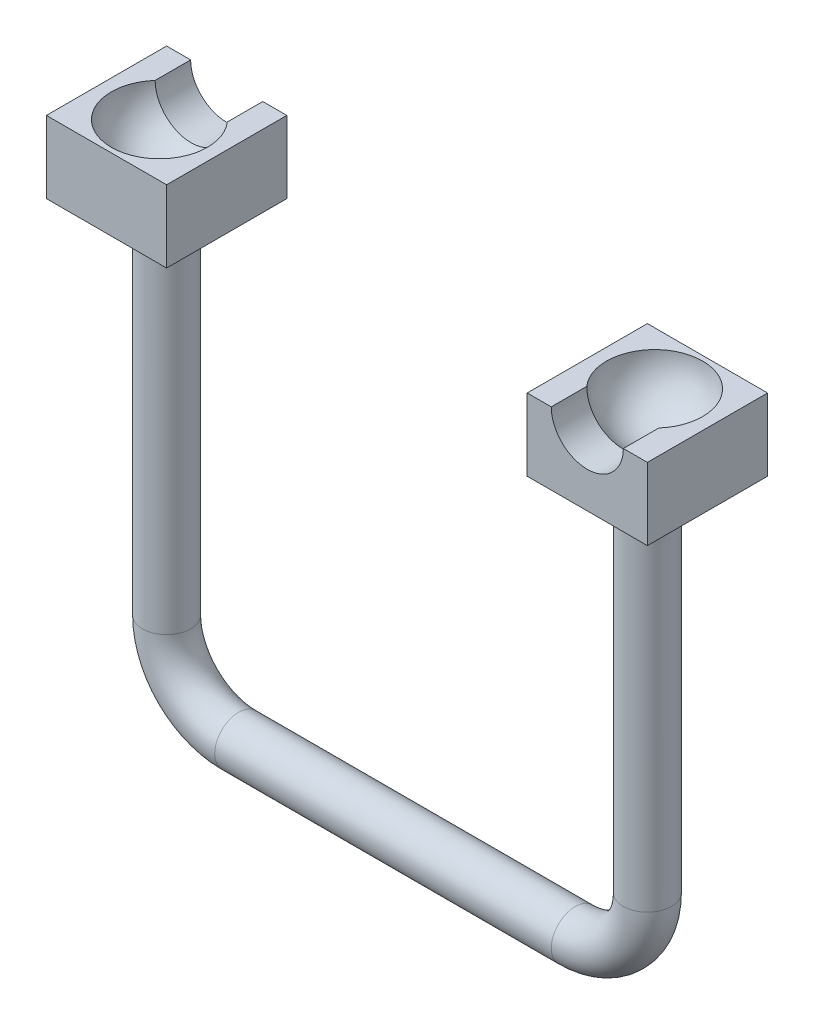
ISO-10303-21;
HEADER;
FILE_DESCRIPTION(('STEP AP214'),'2;1');
FILE_NAME('part.step','',(''),(''),'','','');
FILE_SCHEMA(('AUTOMOTIVE_DESIGN { 1 0 10303 214 1 1 1 1 }'));
ENDSEC;
DATA;
#1=APPLICATION_CONTEXT('core data for automotive mechanical design processes');
#2=APPLICATION_PROTOCOL_DEFINITION('international standard','automotive_design',2000,#1);
#3=PRODUCT_CONTEXT('',#1,'mechanical');
#4=PRODUCT('Part','Part','',(#3));
#5=PRODUCT_RELATED_PRODUCT_CATEGORY('part','',(#4));
#6=PRODUCT_DEFINITION_FORMATION('','',#4);
#7=PRODUCT_DEFINITION_CONTEXT('part definition',#1,'design');
#8=PRODUCT_DEFINITION('design','',#6,#7);
#9=PRODUCT_DEFINITION_SHAPE('','',#8);
#10=(LENGTH_UNIT() NAMED_UNIT(*) SI_UNIT(.MILLI.,.METRE.));
#11=(NAMED_UNIT(*) PLANE_ANGLE_UNIT() SI_UNIT($,.RADIAN.));
#12=(NAMED_UNIT(*) SI_UNIT($,.STERADIAN.) SOLID_ANGLE_UNIT());
#13=UNCERTAINTY_MEASURE_WITH_UNIT(LENGTH_MEASURE(1.E-05),#10,'distance_accuracy_value','');
#14=(GEOMETRIC_REPRESENTATION_CONTEXT(3) GLOBAL_UNCERTAINTY_ASSIGNED_CONTEXT((#13)) GLOBAL_UNIT_ASSIGNED_CONTEXT((#10,
#11,#12)) REPRESENTATION_CONTEXT('',''));
#15=CARTESIAN_POINT('',(0.,0.,0.));
#16=DIRECTION('',(0.,0.,1.));
#17=DIRECTION('',(1.,0.,0.));
#18=AXIS2_PLACEMENT_3D('',#15,#16,#17);
#19=CARTESIAN_POINT('',(0.,0.,0.));
#20=DIRECTION('',(0.,-1.,0.));
#21=DIRECTION('',(1.,0.,0.));
#22=AXIS2_PLACEMENT_3D('',#19,#20,#21);
#23=CYLINDRICAL_SURFACE('',#22,5.);
#24=CARTESIAN_POINT('',(0.,-75.,0.));
#25=DIRECTION('',(0.,1.,0.));
#26=DIRECTION('',(0.,0.,1.));
#27=AXIS2_PLACEMENT_3D('',#24,#25,#26);
#28=CIRCLE('',#27,5.);
#29=CARTESIAN_POINT('',(-5.,-75.,0.));
#30=VERTEX_POINT('',#29);
#31=EDGE_CURVE('E247',#30,#30,#28,.T.);
#32=ORIENTED_EDGE('',*,*,#31,.T.);
#33=EDGE_LOOP('',(#32));
#34=FACE_BOUND('',#33,.T.);
#35=CARTESIAN_POINT('',(0.,0.,0.));
#36=DIRECTION('',(0.,1.,0.));
#37=DIRECTION('',(0.,0.,1.));
#38=AXIS2_PLACEMENT_3D('',#35,#36,#37);
#39=CIRCLE('',#38,5.);
#40=CARTESIAN_POINT('',(0.,0.,5.));
#41=VERTEX_POINT('',#40);
#42=EDGE_CURVE('E243',#41,#41,#39,.T.);
#43=ORIENTED_EDGE('',*,*,#42,.F.);
#44=EDGE_LOOP('',(#43));
#45=FACE_BOUND('',#44,.T.);
#46=ADVANCED_FACE('F38',(#34,#45),#23,.T.);
#47=CARTESIAN_POINT('',(14.9999994517714,-75.,0.));
#48=DIRECTION('',(0.,0.,1.));
#49=DIRECTION('',(1.,0.,0.));
#50=AXIS2_PLACEMENT_3D('',#47,#48,#49);
#51=TOROIDAL_SURFACE('',#50,14.9999994517714,5.);
#52=CARTESIAN_POINT('',(14.9999994517714,-89.9999994517714,0.));
#53=DIRECTION('',(-1.,0.,0.));
#54=DIRECTION('',(0.,0.,1.));
#55=AXIS2_PLACEMENT_3D('',#52,#53,#54);
#56=CIRCLE('',#55,5.);
#57=CARTESIAN_POINT('',(14.9999994517714,-94.9999994517714,0.));
#58=VERTEX_POINT('',#57);
#59=EDGE_CURVE('E251',#58,#58,#56,.T.);
#60=CARTESIAN_POINT('',(14.9999994517714,-75.,0.));
#61=DIRECTION('',(0.,0.,1.));
#62=DIRECTION('',(1.,0.,0.));
#63=AXIS2_PLACEMENT_3D('',#60,#61,#62);
#64=CIRCLE('',#63,19.9999994517714);
#65=EDGE_CURVE('',#30,#58,#64,.T.);
#66=ORIENTED_EDGE('',*,*,#31,.F.);
#67=ORIENTED_EDGE('',*,*,#59,.T.);
#68=ORIENTED_EDGE('',*,*,#65,.T.);
#69=ORIENTED_EDGE('',*,*,#65,.F.);
#70=EDGE_LOOP('',(#66,#68,#67,#69));
#71=FACE_BOUND('',#70,.T.);
#72=ADVANCED_FACE('F327',(#71),#51,.T.);
#73=CARTESIAN_POINT('',(14.9999994517714,-89.9999994517714,0.));
#74=DIRECTION('',(1.,0.,0.));
#75=DIRECTION('',(0.,0.,-1.));
#76=AXIS2_PLACEMENT_3D('',#73,#74,#75);
#77=CYLINDRICAL_SURFACE('',#76,5.);
#78=CARTESIAN_POINT('',(85.,-89.9999994517714,0.));
#79=DIRECTION('',(-1.,0.,0.));
#80=DIRECTION('',(0.,0.,1.));
#81=AXIS2_PLACEMENT_3D('',#78,#79,#80);
#82=CIRCLE('',#81,5.);
#83=CARTESIAN_POINT('',(85.,-94.9999994517714,0.));
#84=VERTEX_POINT('',#83);
#85=EDGE_CURVE('E255',#84,#84,#82,.T.);
#86=ORIENTED_EDGE('',*,*,#85,.T.);
#87=EDGE_LOOP('',(#86));
#88=FACE_BOUND('',#87,.T.);
#89=ORIENTED_EDGE('',*,*,#59,.F.);
#90=EDGE_LOOP('',(#89));
#91=FACE_BOUND('',#90,.T.);
#92=ADVANCED_FACE('F317',(#88,#91),#77,.T.);
#93=CARTESIAN_POINT('',(85.,-74.9999994517714,0.));
#94=DIRECTION('',(0.,0.,1.));
#95=DIRECTION('',(1.,0.,0.));
#96=AXIS2_PLACEMENT_3D('',#93,#94,#95);
#97=TOROIDAL_SURFACE('',#96,15.,5.);
#98=CARTESIAN_POINT('',(100.,-74.9999994517714,0.));
#99=DIRECTION('',(0.,-1.,0.));
#100=DIRECTION('',(0.,0.,1.));
#101=AXIS2_PLACEMENT_3D('',#98,#99,#100);
#102=CIRCLE('',#101,5.);
#103=CARTESIAN_POINT('',(105.,-74.9999994517714,0.));
#104=VERTEX_POINT('',#103);
#105=EDGE_CURVE('E259',#104,#104,#102,.T.);
#106=CARTESIAN_POINT('',(85.,-74.9999994517714,0.));
#107=DIRECTION('',(0.,0.,1.));
#108=DIRECTION('',(1.,0.,0.));
#109=AXIS2_PLACEMENT_3D('',#106,#107,#108);
#110=CIRCLE('',#109,20.);
#111=EDGE_CURVE('',#84,#104,#110,.T.);
#112=ORIENTED_EDGE('',*,*,#85,.F.);
#113=ORIENTED_EDGE('',*,*,#105,.T.);
#114=ORIENTED_EDGE('',*,*,#111,.T.);
#115=ORIENTED_EDGE('',*,*,#111,.F.);
#116=EDGE_LOOP('',(#112,#114,#113,#115));
#117=FACE_BOUND('',#116,.T.);
#118=ADVANCED_FACE('F308',(#117),#97,.T.);
#119=CARTESIAN_POINT('',(100.,-74.9999994517714,0.));
#120=DIRECTION('',(0.,1.,0.));
#121=DIRECTION('',(-1.,0.,0.));
#122=AXIS2_PLACEMENT_3D('',#119,#120,#121);
#123=CYLINDRICAL_SURFACE('',#122,5.);
#124=CARTESIAN_POINT('',(100.,0.,0.));
#125=DIRECTION('',(0.,-1.,0.));
#126=DIRECTION('',(0.,0.,1.));
#127=AXIS2_PLACEMENT_3D('',#124,#125,#126);
#128=CIRCLE('',#127,5.);
#129=CARTESIAN_POINT('',(100.,0.,5.));
#130=VERTEX_POINT('',#129);
#131=EDGE_CURVE('E188',#130,#130,#128,.T.);
#132=ORIENTED_EDGE('',*,*,#131,.T.);
#133=EDGE_LOOP('',(#132));
#134=FACE_BOUND('',#133,.T.);
#135=ORIENTED_EDGE('',*,*,#105,.F.);
#136=EDGE_LOOP('',(#135));
#137=FACE_BOUND('',#136,.T.);
#138=ADVANCED_FACE('F40',(#134,#137),#123,.T.);
#139=CARTESIAN_POINT('',(12.5,15.,12.5));
#140=DIRECTION('',(-1.,0.,0.));
#141=DIRECTION('',(0.,0.,1.));
#142=AXIS2_PLACEMENT_3D('',#139,#140,#141);
#143=PLANE('',#142);
#144=DIRECTION('',(0.,0.,-1.));
#145=VECTOR('',#144,1.);
#146=CARTESIAN_POINT('',(12.5,0.,12.5));
#147=LINE('',#146,#145);
#148=CARTESIAN_POINT('',(12.5,0.,12.5));
#149=VERTEX_POINT('',#148);
#150=CARTESIAN_POINT('',(12.5,0.,-12.5));
#151=VERTEX_POINT('',#150);
#152=EDGE_CURVE('E216',#149,#151,#147,.T.);
#153=ORIENTED_EDGE('',*,*,#152,.T.);
#154=DIRECTION('',(0.,-1.,0.));
#155=VECTOR('',#154,1.);
#156=CARTESIAN_POINT('',(12.5,15.,-12.5));
#157=LINE('',#156,#155);
#158=CARTESIAN_POINT('',(12.5,15.,-12.5));
#159=VERTEX_POINT('',#158);
#160=EDGE_CURVE('E239',#159,#151,#157,.T.);
#161=ORIENTED_EDGE('',*,*,#160,.F.);
#162=DIRECTION('',(0.,0.,-1.));
#163=VECTOR('',#162,1.);
#164=CARTESIAN_POINT('',(12.5,15.,12.5));
#165=LINE('',#164,#163);
#166=CARTESIAN_POINT('',(12.5,15.,12.5));
#167=VERTEX_POINT('',#166);
#168=EDGE_CURVE('E199',#167,#159,#165,.T.);
#169=ORIENTED_EDGE('',*,*,#168,.F.);
#170=DIRECTION('',(0.,-1.,0.));
#171=VECTOR('',#170,1.);
#172=CARTESIAN_POINT('',(12.5,15.,12.5));
#173=LINE('',#172,#171);
#174=EDGE_CURVE('E215',#167,#149,#173,.T.);
#175=ORIENTED_EDGE('',*,*,#174,.T.);
#176=EDGE_LOOP('',(#153,#161,#169,#175));
#177=FACE_BOUND('',#176,.T.);
#178=ADVANCED_FACE('F307',(#177),#143,.F.);
#179=CARTESIAN_POINT('',(-12.5,15.,-12.5));
#180=DIRECTION('',(0.,0.,1.));
#181=DIRECTION('',(1.,0.,0.));
#182=AXIS2_PLACEMENT_3D('',#179,#180,#181);
#183=PLANE('',#182);
#184=DIRECTION('',(-1.,0.,0.));
#185=VECTOR('',#184,1.);
#186=CARTESIAN_POINT('',(-12.5,15.,-12.5));
#187=LINE('',#186,#185);
#188=CARTESIAN_POINT('',(-7.5,15.,-12.5));
#189=VERTEX_POINT('',#188);
#190=CARTESIAN_POINT('',(-12.5,15.,-12.5));
#191=VERTEX_POINT('',#190);
#192=EDGE_CURVE('E203',#189,#191,#187,.T.);
#193=ORIENTED_EDGE('',*,*,#192,.F.);
#194=CARTESIAN_POINT('',(0.,15.,-12.5));
#195=DIRECTION('',(0.,0.,-1.));
#196=DIRECTION('',(-1.,0.,0.));
#197=AXIS2_PLACEMENT_3D('',#194,#195,#196);
#198=CIRCLE('',#197,7.5);
#199=CARTESIAN_POINT('',(7.5,15.,-12.5));
#200=VERTEX_POINT('',#199);
#201=EDGE_CURVE('E189',#200,#189,#198,.T.);
#202=ORIENTED_EDGE('',*,*,#201,.F.);
#203=EDGE_CURVE('E205',#159,#200,#187,.T.);
#204=ORIENTED_EDGE('',*,*,#203,.F.);
#205=ORIENTED_EDGE('',*,*,#160,.T.);
#206=DIRECTION('',(-1.,0.,0.));
#207=VECTOR('',#206,1.);
#208=CARTESIAN_POINT('',(-12.5,0.,-12.5));
#209=LINE('',#208,#207);
#210=CARTESIAN_POINT('',(-12.5,0.,-12.5));
#211=VERTEX_POINT('',#210);
#212=EDGE_CURVE('E220',#151,#211,#209,.T.);
#213=ORIENTED_EDGE('',*,*,#212,.T.);
#214=DIRECTION('',(0.,-1.,0.));
#215=VECTOR('',#214,1.);
#216=CARTESIAN_POINT('',(-12.5,15.,-12.5));
#217=LINE('',#216,#215);
#218=EDGE_CURVE('E235',#191,#211,#217,.T.);
#219=ORIENTED_EDGE('',*,*,#218,.F.);
#220=EDGE_LOOP('',(#193,#202,#204,#205,#213,#219));
#221=FACE_BOUND('',#220,.T.);
#222=ADVANCED_FACE('F314',(#221),#183,.F.);
#223=CARTESIAN_POINT('',(-12.5,15.,12.5));
#224=DIRECTION('',(1.,0.,0.));
#225=DIRECTION('',(0.,0.,-1.));
#226=AXIS2_PLACEMENT_3D('',#223,#224,#225);
#227=PLANE('',#226);
#228=DIRECTION('',(0.,0.,1.));
#229=VECTOR('',#228,1.);
#230=CARTESIAN_POINT('',(-12.5,0.,12.5));
#231=LINE('',#230,#229);
#232=CARTESIAN_POINT('',(-12.5,0.,12.5));
#233=VERTEX_POINT('',#232);
#234=EDGE_CURVE('E223',#211,#233,#231,.T.);
#235=ORIENTED_EDGE('',*,*,#234,.T.);
#236=DIRECTION('',(0.,-1.,0.));
#237=VECTOR('',#236,1.);
#238=CARTESIAN_POINT('',(-12.5,15.,12.5));
#239=LINE('',#238,#237);
#240=CARTESIAN_POINT('',(-12.5,15.,12.5));
#241=VERTEX_POINT('',#240);
#242=EDGE_CURVE('E231',#241,#233,#239,.T.);
#243=ORIENTED_EDGE('',*,*,#242,.F.);
#244=DIRECTION('',(0.,0.,1.));
#245=VECTOR('',#244,1.);
#246=CARTESIAN_POINT('',(-12.5,15.,12.5));
#247=LINE('',#246,#245);
#248=EDGE_CURVE('E209',#191,#241,#247,.T.);
#249=ORIENTED_EDGE('',*,*,#248,.F.);
#250=ORIENTED_EDGE('',*,*,#218,.T.);
#251=EDGE_LOOP('',(#235,#243,#249,#250));
#252=FACE_BOUND('',#251,.T.);
#253=ADVANCED_FACE('F358',(#252),#227,.F.);
#254=CARTESIAN_POINT('',(-12.5,15.,12.5));
#255=DIRECTION('',(0.,0.,-1.));
#256=DIRECTION('',(-1.,0.,0.));
#257=AXIS2_PLACEMENT_3D('',#254,#255,#256);
#258=PLANE('',#257);
#259=DIRECTION('',(1.,0.,0.));
#260=VECTOR('',#259,1.);
#261=CARTESIAN_POINT('',(-12.5,0.,12.5));
#262=LINE('',#261,#260);
#263=EDGE_CURVE('E204',#233,#149,#262,.T.);
#264=ORIENTED_EDGE('',*,*,#263,.T.);
#265=ORIENTED_EDGE('',*,*,#174,.F.);
#266=DIRECTION('',(1.,0.,0.));
#267=VECTOR('',#266,1.);
#268=CARTESIAN_POINT('',(-12.5,15.,12.5));
#269=LINE('',#268,#267);
#270=EDGE_CURVE('E212',#241,#167,#269,.T.);
#271=ORIENTED_EDGE('',*,*,#270,.F.);
#272=ORIENTED_EDGE('',*,*,#242,.T.);
#273=EDGE_LOOP('',(#264,#265,#271,#272));
#274=FACE_BOUND('',#273,.T.);
#275=ADVANCED_FACE('F354',(#274),#258,.F.);
#276=CARTESIAN_POINT('',(0.,15.,0.));
#277=DIRECTION('',(0.,-1.,0.));
#278=DIRECTION('',(0.,0.,-1.));
#279=AXIS2_PLACEMENT_3D('',#276,#277,#278);
#280=PLANE('',#279);
#281=CARTESIAN_POINT('',(0.,15.,1.5));
#282=DIRECTION('',(0.,-1.,0.));
#283=DIRECTION('',(0.,0.,-1.));
#284=AXIS2_PLACEMENT_3D('',#281,#282,#283);
#285=CIRCLE('',#284,10.);
#286=CARTESIAN_POINT('',(-7.5,15.,-5.11437827766148));
#287=VERTEX_POINT('',#286);
#288=CARTESIAN_POINT('',(7.5,15.,-5.11437827766148));
#289=VERTEX_POINT('',#288);
#290=EDGE_CURVE('E198',#287,#289,#285,.F.);
#291=ORIENTED_EDGE('',*,*,#290,.F.);
#292=DIRECTION('',(0.,0.,-1.));
#293=VECTOR('',#292,1.);
#294=CARTESIAN_POINT('',(-7.5,15.,2.5));
#295=LINE('',#294,#293);
#296=EDGE_CURVE('E61',#287,#189,#295,.T.);
#297=ORIENTED_EDGE('',*,*,#296,.T.);
#298=ORIENTED_EDGE('',*,*,#192,.T.);
#299=ORIENTED_EDGE('',*,*,#248,.T.);
#300=ORIENTED_EDGE('',*,*,#270,.T.);
#301=ORIENTED_EDGE('',*,*,#168,.T.);
#302=ORIENTED_EDGE('',*,*,#203,.T.);
#303=DIRECTION('',(0.,0.,-1.));
#304=VECTOR('',#303,1.);
#305=CARTESIAN_POINT('',(7.5,15.,2.5));
#306=LINE('',#305,#304);
#307=EDGE_CURVE('E192',#200,#289,#306,.F.);
#308=ORIENTED_EDGE('',*,*,#307,.T.);
#309=EDGE_LOOP('',(#291,#297,#298,#299,#300,#301,#302,#308));
#310=FACE_BOUND('',#309,.T.);
#311=ADVANCED_FACE('F344',(#310),#280,.F.);
#312=CARTESIAN_POINT('',(0.,0.,0.));
#313=DIRECTION('',(0.,-1.,0.));
#314=DIRECTION('',(0.,0.,-1.));
#315=AXIS2_PLACEMENT_3D('',#312,#313,#314);
#316=PLANE('',#315);
#317=ORIENTED_EDGE('',*,*,#42,.T.);
#318=EDGE_LOOP('',(#317));
#319=FACE_BOUND('',#318,.T.);
#320=ORIENTED_EDGE('',*,*,#152,.F.);
#321=ORIENTED_EDGE('',*,*,#263,.F.);
#322=ORIENTED_EDGE('',*,*,#234,.F.);
#323=ORIENTED_EDGE('',*,*,#212,.F.);
#324=EDGE_LOOP('',(#320,#321,#322,#323));
#325=FACE_BOUND('',#324,.T.);
#326=ADVANCED_FACE('F341',(#319,#325),#316,.T.);
#327=CARTESIAN_POINT('',(0.,15.,1.5));
#328=DIRECTION('',(0.,0.,-1.));
#329=DIRECTION('',(1.,0.,0.));
#330=AXIS2_PLACEMENT_3D('',#327,#328,#329);
#331=SPHERICAL_SURFACE('',#330,10.);
#332=CARTESIAN_POINT('',(0.,15.,-5.11437827766148));
#333=DIRECTION('',(0.,0.,1.));
#334=DIRECTION('',(1.,0.,0.));
#335=AXIS2_PLACEMENT_3D('',#332,#333,#334);
#336=CIRCLE('',#335,7.5);
#337=EDGE_CURVE('E47',#287,#289,#336,.T.);
#338=ORIENTED_EDGE('',*,*,#337,.F.);
#339=ORIENTED_EDGE('',*,*,#290,.T.);
#340=EDGE_LOOP('',(#338,#339));
#341=FACE_BOUND('',#340,.T.);
#342=ADVANCED_FACE('F304',(#341),#331,.F.);
#343=CARTESIAN_POINT('',(0.,15.,2.5));
#344=DIRECTION('',(0.,0.,-1.));
#345=DIRECTION('',(-1.,0.,0.));
#346=AXIS2_PLACEMENT_3D('',#343,#344,#345);
#347=CYLINDRICAL_SURFACE('',#346,7.5);
#348=ORIENTED_EDGE('',*,*,#337,.T.);
#349=ORIENTED_EDGE('',*,*,#307,.F.);
#350=ORIENTED_EDGE('',*,*,#201,.T.);
#351=ORIENTED_EDGE('',*,*,#296,.F.);
#352=EDGE_LOOP('',(#348,#349,#350,#351));
#353=FACE_BOUND('',#352,.T.);
#354=ADVANCED_FACE('F297',(#353),#347,.F.);
#355=CARTESIAN_POINT('',(112.5,15.,12.5));
#356=DIRECTION('',(-1.,0.,0.));
#357=DIRECTION('',(0.,-1.,0.));
#358=AXIS2_PLACEMENT_3D('',#355,#356,#357);
#359=PLANE('',#358);
#360=DIRECTION('',(0.,0.,-1.));
#361=VECTOR('',#360,1.);
#362=CARTESIAN_POINT('',(112.5,0.,12.5));
#363=LINE('',#362,#361);
#364=CARTESIAN_POINT('',(112.5,0.,12.5));
#365=VERTEX_POINT('',#364);
#366=CARTESIAN_POINT('',(112.5,0.,-12.5));
#367=VERTEX_POINT('',#366);
#368=EDGE_CURVE('E160',#365,#367,#363,.T.);
#369=ORIENTED_EDGE('',*,*,#368,.T.);
#370=DIRECTION('',(0.,-1.,0.));
#371=VECTOR('',#370,1.);
#372=CARTESIAN_POINT('',(112.5,15.,-12.5));
#373=LINE('',#372,#371);
#374=CARTESIAN_POINT('',(112.5,15.,-12.5));
#375=VERTEX_POINT('',#374);
#376=EDGE_CURVE('E184',#375,#367,#373,.T.);
#377=ORIENTED_EDGE('',*,*,#376,.F.);
#378=DIRECTION('',(0.,0.,-1.));
#379=VECTOR('',#378,1.);
#380=CARTESIAN_POINT('',(112.5,15.,12.5));
#381=LINE('',#380,#379);
#382=CARTESIAN_POINT('',(112.5,15.,12.5));
#383=VERTEX_POINT('',#382);
#384=EDGE_CURVE('E173',#383,#375,#381,.T.);
#385=ORIENTED_EDGE('',*,*,#384,.F.);
#386=DIRECTION('',(0.,-1.,0.));
#387=VECTOR('',#386,1.);
#388=CARTESIAN_POINT('',(112.5,15.,12.5));
#389=LINE('',#388,#387);
#390=EDGE_CURVE('E147',#383,#365,#389,.T.);
#391=ORIENTED_EDGE('',*,*,#390,.T.);
#392=EDGE_LOOP('',(#369,#377,#385,#391));
#393=FACE_BOUND('',#392,.T.);
#394=ADVANCED_FACE('F295',(#393),#359,.F.);
#395=CARTESIAN_POINT('',(87.5,15.,-12.5));
#396=DIRECTION('',(0.,0.,1.));
#397=DIRECTION('',(1.,0.,0.));
#398=AXIS2_PLACEMENT_3D('',#395,#396,#397);
#399=PLANE('',#398);
#400=DIRECTION('',(-1.,0.,0.));
#401=VECTOR('',#400,1.);
#402=CARTESIAN_POINT('',(87.5,0.,-12.5));
#403=LINE('',#402,#401);
#404=CARTESIAN_POINT('',(87.5,0.,-12.5));
#405=VERTEX_POINT('',#404);
#406=EDGE_CURVE('E164',#367,#405,#403,.T.);
#407=ORIENTED_EDGE('',*,*,#406,.T.);
#408=DIRECTION('',(0.,-1.,0.));
#409=VECTOR('',#408,1.);
#410=CARTESIAN_POINT('',(87.5,15.,-12.5));
#411=LINE('',#410,#409);
#412=CARTESIAN_POINT('',(87.5,15.,-12.5));
#413=VERTEX_POINT('',#412);
#414=EDGE_CURVE('E180',#413,#405,#411,.T.);
#415=ORIENTED_EDGE('',*,*,#414,.F.);
#416=DIRECTION('',(-1.,0.,0.));
#417=VECTOR('',#416,1.);
#418=CARTESIAN_POINT('',(87.5,15.,-12.5));
#419=LINE('',#418,#417);
#420=EDGE_CURVE('E156',#375,#413,#419,.T.);
#421=ORIENTED_EDGE('',*,*,#420,.F.);
#422=ORIENTED_EDGE('',*,*,#376,.T.);
#423=EDGE_LOOP('',(#407,#415,#421,#422));
#424=FACE_BOUND('',#423,.T.);
#425=ADVANCED_FACE('F286',(#424),#399,.F.);
#426=CARTESIAN_POINT('',(87.5,15.,12.5));
#427=DIRECTION('',(1.,0.,0.));
#428=DIRECTION('',(0.,1.,0.));
#429=AXIS2_PLACEMENT_3D('',#426,#427,#428);
#430=PLANE('',#429);
#431=DIRECTION('',(0.,0.,1.));
#432=VECTOR('',#431,1.);
#433=CARTESIAN_POINT('',(87.5,0.,12.5));
#434=LINE('',#433,#432);
#435=CARTESIAN_POINT('',(87.5,0.,12.5));
#436=VERTEX_POINT('',#435);
#437=EDGE_CURVE('E167',#405,#436,#434,.T.);
#438=ORIENTED_EDGE('',*,*,#437,.T.);
#439=DIRECTION('',(0.,-1.,0.));
#440=VECTOR('',#439,1.);
#441=CARTESIAN_POINT('',(87.5,15.,12.5));
#442=LINE('',#441,#440);
#443=CARTESIAN_POINT('',(87.5,15.,12.5));
#444=VERTEX_POINT('',#443);
#445=EDGE_CURVE('E176',#444,#436,#442,.T.);
#446=ORIENTED_EDGE('',*,*,#445,.F.);
#447=DIRECTION('',(0.,0.,1.));
#448=VECTOR('',#447,1.);
#449=CARTESIAN_POINT('',(87.5,15.,12.5));
#450=LINE('',#449,#448);
#451=EDGE_CURVE('E151',#413,#444,#450,.T.);
#452=ORIENTED_EDGE('',*,*,#451,.F.);
#453=ORIENTED_EDGE('',*,*,#414,.T.);
#454=EDGE_LOOP('',(#438,#446,#452,#453));
#455=FACE_BOUND('',#454,.T.);
#456=ADVANCED_FACE('F289',(#455),#430,.F.);
#457=CARTESIAN_POINT('',(87.5,15.,12.5));
#458=DIRECTION('',(0.,0.,-1.));
#459=DIRECTION('',(-1.,0.,0.));
#460=AXIS2_PLACEMENT_3D('',#457,#458,#459);
#461=PLANE('',#460);
#462=DIRECTION('',(1.,0.,0.));
#463=VECTOR('',#462,1.);
#464=CARTESIAN_POINT('',(87.5,15.,12.5));
#465=LINE('',#464,#463);
#466=CARTESIAN_POINT('',(107.5,15.,12.5));
#467=VERTEX_POINT('',#466);
#468=EDGE_CURVE('E139',#467,#383,#465,.T.);
#469=ORIENTED_EDGE('',*,*,#468,.F.);
#470=CARTESIAN_POINT('',(100.,15.,12.5));
#471=DIRECTION('',(0.,0.,1.));
#472=DIRECTION('',(1.,0.,0.));
#473=AXIS2_PLACEMENT_3D('',#470,#471,#472);
#474=CIRCLE('',#473,7.50000000000001);
#475=CARTESIAN_POINT('',(92.5,15.,12.5));
#476=VERTEX_POINT('',#475);
#477=EDGE_CURVE('E125',#476,#467,#474,.T.);
#478=ORIENTED_EDGE('',*,*,#477,.F.);
#479=EDGE_CURVE('E150',#444,#476,#465,.T.);
#480=ORIENTED_EDGE('',*,*,#479,.F.);
#481=ORIENTED_EDGE('',*,*,#445,.T.);
#482=DIRECTION('',(1.,0.,0.));
#483=VECTOR('',#482,1.);
#484=CARTESIAN_POINT('',(87.5,0.,12.5));
#485=LINE('',#484,#483);
#486=EDGE_CURVE('E170',#436,#365,#485,.T.);
#487=ORIENTED_EDGE('',*,*,#486,.T.);
#488=ORIENTED_EDGE('',*,*,#390,.F.);
#489=EDGE_LOOP('',(#469,#478,#480,#481,#487,#488));
#490=FACE_BOUND('',#489,.T.);
#491=ADVANCED_FACE('F145',(#490),#461,.F.);
#492=CARTESIAN_POINT('',(0.,15.,0.));
#493=DIRECTION('',(0.,-1.,0.));
#494=DIRECTION('',(1.,0.,0.));
#495=AXIS2_PLACEMENT_3D('',#492,#493,#494);
#496=PLANE('',#495);
#497=CARTESIAN_POINT('',(100.,15.,-1.5));
#498=DIRECTION('',(0.,-1.,0.));
#499=DIRECTION('',(1.,0.,0.));
#500=AXIS2_PLACEMENT_3D('',#497,#498,#499);
#501=CIRCLE('',#500,9.99999999999999);
#502=CARTESIAN_POINT('',(107.5,15.,5.11437827766145));
#503=VERTEX_POINT('',#502);
#504=CARTESIAN_POINT('',(92.5,15.,5.11437827766145));
#505=VERTEX_POINT('',#504);
#506=EDGE_CURVE('E142',#503,#505,#501,.F.);
#507=ORIENTED_EDGE('',*,*,#506,.F.);
#508=DIRECTION('',(0.,0.,1.));
#509=VECTOR('',#508,1.);
#510=CARTESIAN_POINT('',(107.5,15.,-2.5));
#511=LINE('',#510,#509);
#512=EDGE_CURVE('E53',#503,#467,#511,.T.);
#513=ORIENTED_EDGE('',*,*,#512,.T.);
#514=ORIENTED_EDGE('',*,*,#468,.T.);
#515=ORIENTED_EDGE('',*,*,#384,.T.);
#516=ORIENTED_EDGE('',*,*,#420,.T.);
#517=ORIENTED_EDGE('',*,*,#451,.T.);
#518=ORIENTED_EDGE('',*,*,#479,.T.);
#519=DIRECTION('',(0.,0.,1.));
#520=VECTOR('',#519,1.);
#521=CARTESIAN_POINT('',(92.5,15.,-2.5));
#522=LINE('',#521,#520);
#523=EDGE_CURVE('E128',#476,#505,#522,.F.);
#524=ORIENTED_EDGE('',*,*,#523,.T.);
#525=EDGE_LOOP('',(#507,#513,#514,#515,#516,#517,#518,#524));
#526=FACE_BOUND('',#525,.T.);
#527=ADVANCED_FACE('F137',(#526),#496,.F.);
#528=CARTESIAN_POINT('',(0.,0.,0.));
#529=DIRECTION('',(0.,-1.,0.));
#530=DIRECTION('',(1.,0.,0.));
#531=AXIS2_PLACEMENT_3D('',#528,#529,#530);
#532=PLANE('',#531);
#533=ORIENTED_EDGE('',*,*,#131,.F.);
#534=EDGE_LOOP('',(#533));
#535=FACE_BOUND('',#534,.T.);
#536=ORIENTED_EDGE('',*,*,#368,.F.);
#537=ORIENTED_EDGE('',*,*,#486,.F.);
#538=ORIENTED_EDGE('',*,*,#437,.F.);
#539=ORIENTED_EDGE('',*,*,#406,.F.);
#540=EDGE_LOOP('',(#536,#537,#538,#539));
#541=FACE_BOUND('',#540,.T.);
#542=ADVANCED_FACE('F293',(#535,#541),#532,.T.);
#543=CARTESIAN_POINT('',(100.,15.,-1.5));
#544=DIRECTION('',(0.,0.,-1.));
#545=DIRECTION('',(1.,0.,0.));
#546=AXIS2_PLACEMENT_3D('',#543,#544,#545);
#547=SPHERICAL_SURFACE('',#546,9.99999999999999);
#548=CARTESIAN_POINT('',(100.,15.,5.11437827766145));
#549=DIRECTION('',(0.,0.,-1.));
#550=DIRECTION('',(-1.,0.,0.));
#551=AXIS2_PLACEMENT_3D('',#548,#549,#550);
#552=CIRCLE('',#551,7.50000000000001);
#553=EDGE_CURVE('E11',#503,#505,#552,.T.);
#554=ORIENTED_EDGE('',*,*,#553,.F.);
#555=ORIENTED_EDGE('',*,*,#506,.T.);
#556=EDGE_LOOP('',(#554,#555));
#557=FACE_BOUND('',#556,.T.);
#558=ADVANCED_FACE('F273',(#557),#547,.F.);
#559=CARTESIAN_POINT('',(100.,15.,-2.5));
#560=DIRECTION('',(0.,0.,1.));
#561=DIRECTION('',(1.,0.,0.));
#562=AXIS2_PLACEMENT_3D('',#559,#560,#561);
#563=CYLINDRICAL_SURFACE('',#562,7.50000000000001);
#564=ORIENTED_EDGE('',*,*,#553,.T.);
#565=ORIENTED_EDGE('',*,*,#523,.F.);
#566=ORIENTED_EDGE('',*,*,#477,.T.);
#567=ORIENTED_EDGE('',*,*,#512,.F.);
#568=EDGE_LOOP('',(#564,#565,#566,#567));
#569=FACE_BOUND('',#568,.T.);
#570=ADVANCED_FACE('F126',(#569),#563,.F.);
#571=CLOSED_SHELL('',(#46,#72,#92,#118,#138,#178,#222,#253,#275,#311,#326,#342,#354,#394,#425,
#456,#491,#527,#542,#558,#570));
#572=MANIFOLD_SOLID_BREP('B2',#571);
#573=ADVANCED_BREP_SHAPE_REPRESENTATION('',(#18,#572),#14);
#574=SHAPE_DEFINITION_REPRESENTATION(#9,#573);
ENDSEC;
END-ISO-10303-21;
